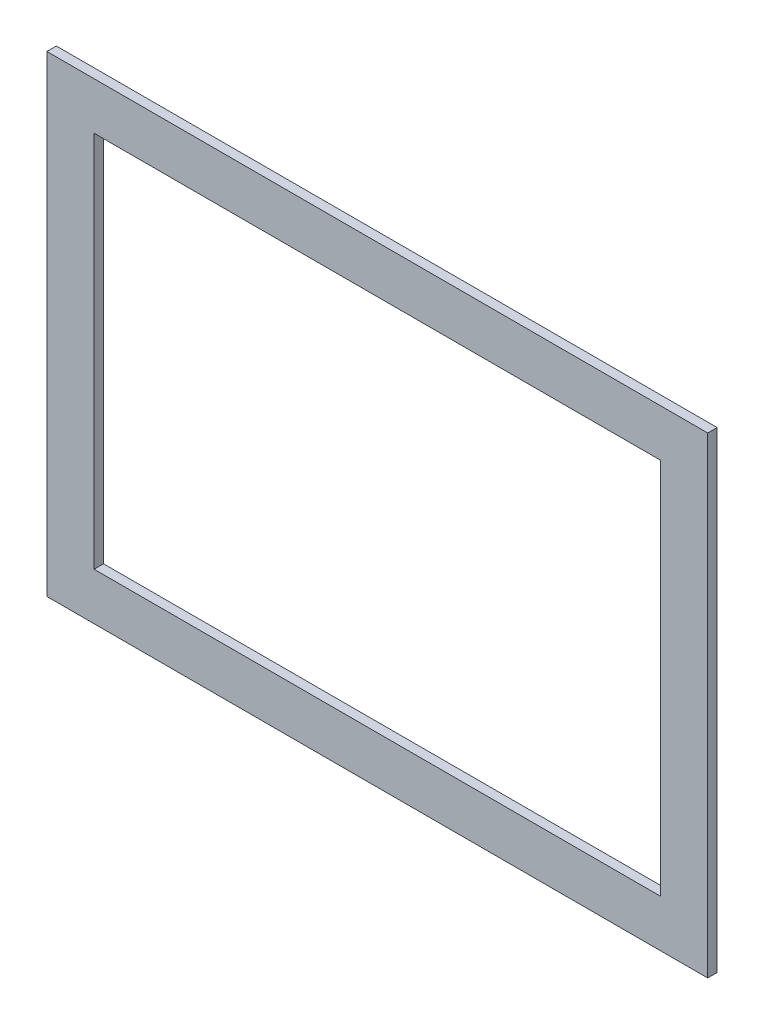
ISO-10303-21;
HEADER;
FILE_DESCRIPTION(('STEP AP214'),'2;1');
FILE_NAME('part.step','',(''),(''),'','','');
FILE_SCHEMA(('AUTOMOTIVE_DESIGN { 1 0 10303 214 1 1 1 1 }'));
ENDSEC;
DATA;
#1=APPLICATION_CONTEXT('core data for automotive mechanical design processes');
#2=APPLICATION_PROTOCOL_DEFINITION('international standard','automotive_design',2000,#1);
#3=PRODUCT_CONTEXT('',#1,'mechanical');
#4=PRODUCT('Part','Part','',(#3));
#5=PRODUCT_RELATED_PRODUCT_CATEGORY('part','',(#4));
#6=PRODUCT_DEFINITION_FORMATION('','',#4);
#7=PRODUCT_DEFINITION_CONTEXT('part definition',#1,'design');
#8=PRODUCT_DEFINITION('design','',#6,#7);
#9=PRODUCT_DEFINITION_SHAPE('','',#8);
#10=(LENGTH_UNIT() NAMED_UNIT(*) SI_UNIT(.MILLI.,.METRE.));
#11=(NAMED_UNIT(*) PLANE_ANGLE_UNIT() SI_UNIT($,.RADIAN.));
#12=(NAMED_UNIT(*) SI_UNIT($,.STERADIAN.) SOLID_ANGLE_UNIT());
#13=UNCERTAINTY_MEASURE_WITH_UNIT(LENGTH_MEASURE(1.E-05),#10,'distance_accuracy_value','');
#14=(GEOMETRIC_REPRESENTATION_CONTEXT(3) GLOBAL_UNCERTAINTY_ASSIGNED_CONTEXT((#13)) GLOBAL_UNIT_ASSIGNED_CONTEXT((#10,
#11,#12)) REPRESENTATION_CONTEXT('',''));
#15=CARTESIAN_POINT('',(0.,0.,0.));
#16=DIRECTION('',(0.,0.,1.));
#17=DIRECTION('',(1.,0.,0.));
#18=AXIS2_PLACEMENT_3D('',#15,#16,#17);
#19=CARTESIAN_POINT('',(0.,0.,10.));
#20=DIRECTION('',(-1.,0.,0.));
#21=DIRECTION('',(0.,-1.,0.));
#22=AXIS2_PLACEMENT_3D('',#19,#20,#21);
#23=PLANE('',#22);
#24=DIRECTION('',(0.,1.,0.));
#25=VECTOR('',#24,1.);
#26=CARTESIAN_POINT('',(0.,0.,0.));
#27=LINE('',#26,#25);
#28=CARTESIAN_POINT('',(0.,0.,0.));
#29=VERTEX_POINT('',#28);
#30=CARTESIAN_POINT('',(0.,500.,0.));
#31=VERTEX_POINT('',#30);
#32=EDGE_CURVE('E130',#29,#31,#27,.T.);
#33=ORIENTED_EDGE('',*,*,#32,.T.);
#34=DIRECTION('',(0.,0.,-1.));
#35=VECTOR('',#34,1.);
#36=CARTESIAN_POINT('',(0.,500.,10.));
#37=LINE('',#36,#35);
#38=CARTESIAN_POINT('',(0.,500.,10.));
#39=VERTEX_POINT('',#38);
#40=EDGE_CURVE('E11',#39,#31,#37,.T.);
#41=ORIENTED_EDGE('',*,*,#40,.F.);
#42=DIRECTION('',(0.,1.,0.));
#43=VECTOR('',#42,1.);
#44=CARTESIAN_POINT('',(0.,0.,10.));
#45=LINE('',#44,#43);
#46=CARTESIAN_POINT('',(0.,0.,10.));
#47=VERTEX_POINT('',#46);
#48=EDGE_CURVE('E134',#47,#39,#45,.T.);
#49=ORIENTED_EDGE('',*,*,#48,.F.);
#50=DIRECTION('',(0.,0.,-1.));
#51=VECTOR('',#50,1.);
#52=CARTESIAN_POINT('',(0.,0.,10.));
#53=LINE('',#52,#51);
#54=EDGE_CURVE('E144',#47,#29,#53,.T.);
#55=ORIENTED_EDGE('',*,*,#54,.T.);
#56=EDGE_LOOP('',(#33,#41,#49,#55));
#57=FACE_BOUND('',#56,.T.);
#58=ADVANCED_FACE('F33',(#57),#23,.F.);
#59=CARTESIAN_POINT('',(0.,500.,10.));
#60=DIRECTION('',(0.,-1.,0.));
#61=DIRECTION('',(0.,0.,-1.));
#62=AXIS2_PLACEMENT_3D('',#59,#60,#61);
#63=PLANE('',#62);
#64=DIRECTION('',(-1.,0.,0.));
#65=VECTOR('',#64,1.);
#66=CARTESIAN_POINT('',(0.,500.,0.));
#67=LINE('',#66,#65);
#68=CARTESIAN_POINT('',(-700.,500.,0.));
#69=VERTEX_POINT('',#68);
#70=EDGE_CURVE('E147',#31,#69,#67,.T.);
#71=ORIENTED_EDGE('',*,*,#70,.T.);
#72=DIRECTION('',(0.,0.,-1.));
#73=VECTOR('',#72,1.);
#74=CARTESIAN_POINT('',(-700.,500.,10.));
#75=LINE('',#74,#73);
#76=CARTESIAN_POINT('',(-700.,500.,10.));
#77=VERTEX_POINT('',#76);
#78=EDGE_CURVE('E40',#77,#69,#75,.T.);
#79=ORIENTED_EDGE('',*,*,#78,.F.);
#80=DIRECTION('',(-1.,0.,0.));
#81=VECTOR('',#80,1.);
#82=CARTESIAN_POINT('',(0.,500.,10.));
#83=LINE('',#82,#81);
#84=EDGE_CURVE('E137',#39,#77,#83,.T.);
#85=ORIENTED_EDGE('',*,*,#84,.F.);
#86=ORIENTED_EDGE('',*,*,#40,.T.);
#87=EDGE_LOOP('',(#71,#79,#85,#86));
#88=FACE_BOUND('',#87,.T.);
#89=ADVANCED_FACE('F175',(#88),#63,.F.);
#90=CARTESIAN_POINT('',(-700.,0.,10.));
#91=DIRECTION('',(1.,0.,0.));
#92=DIRECTION('',(0.,1.,0.));
#93=AXIS2_PLACEMENT_3D('',#90,#91,#92);
#94=PLANE('',#93);
#95=DIRECTION('',(0.,-1.,0.));
#96=VECTOR('',#95,1.);
#97=CARTESIAN_POINT('',(-700.,0.,0.));
#98=LINE('',#97,#96);
#99=CARTESIAN_POINT('',(-700.,0.,0.));
#100=VERTEX_POINT('',#99);
#101=EDGE_CURVE('E149',#69,#100,#98,.T.);
#102=ORIENTED_EDGE('',*,*,#101,.T.);
#103=DIRECTION('',(0.,0.,-1.));
#104=VECTOR('',#103,1.);
#105=CARTESIAN_POINT('',(-700.,0.,10.));
#106=LINE('',#105,#104);
#107=CARTESIAN_POINT('',(-700.,0.,10.));
#108=VERTEX_POINT('',#107);
#109=EDGE_CURVE('E154',#108,#100,#106,.T.);
#110=ORIENTED_EDGE('',*,*,#109,.F.);
#111=DIRECTION('',(0.,-1.,0.));
#112=VECTOR('',#111,1.);
#113=CARTESIAN_POINT('',(-700.,0.,10.));
#114=LINE('',#113,#112);
#115=EDGE_CURVE('E140',#77,#108,#114,.T.);
#116=ORIENTED_EDGE('',*,*,#115,.F.);
#117=ORIENTED_EDGE('',*,*,#78,.T.);
#118=EDGE_LOOP('',(#102,#110,#116,#117));
#119=FACE_BOUND('',#118,.T.);
#120=ADVANCED_FACE('F161',(#119),#94,.F.);
#121=CARTESIAN_POINT('',(0.,0.,10.));
#122=DIRECTION('',(0.,1.,0.));
#123=DIRECTION('',(-1.,0.,0.));
#124=AXIS2_PLACEMENT_3D('',#121,#122,#123);
#125=PLANE('',#124);
#126=DIRECTION('',(1.,0.,0.));
#127=VECTOR('',#126,1.);
#128=CARTESIAN_POINT('',(0.,0.,0.));
#129=LINE('',#128,#127);
#130=EDGE_CURVE('E138',#100,#29,#129,.T.);
#131=ORIENTED_EDGE('',*,*,#130,.T.);
#132=ORIENTED_EDGE('',*,*,#54,.F.);
#133=DIRECTION('',(1.,0.,0.));
#134=VECTOR('',#133,1.);
#135=CARTESIAN_POINT('',(0.,0.,10.));
#136=LINE('',#135,#134);
#137=EDGE_CURVE('E142',#108,#47,#136,.T.);
#138=ORIENTED_EDGE('',*,*,#137,.F.);
#139=ORIENTED_EDGE('',*,*,#109,.T.);
#140=EDGE_LOOP('',(#131,#132,#138,#139));
#141=FACE_BOUND('',#140,.T.);
#142=ADVANCED_FACE('F168',(#141),#125,.F.);
#143=CARTESIAN_POINT('',(0.,0.,10.));
#144=DIRECTION('',(0.,0.,1.));
#145=DIRECTION('',(1.,0.,0.));
#146=AXIS2_PLACEMENT_3D('',#143,#144,#145);
#147=PLANE('',#146);
#148=DIRECTION('',(0.,-1.,0.));
#149=VECTOR('',#148,1.);
#150=CARTESIAN_POINT('',(-650.,450.,10.));
#151=LINE('',#150,#149);
#152=CARTESIAN_POINT('',(-650.,450.,10.));
#153=VERTEX_POINT('',#152);
#154=CARTESIAN_POINT('',(-650.,50.,10.));
#155=VERTEX_POINT('',#154);
#156=EDGE_CURVE('E47',#153,#155,#151,.T.);
#157=ORIENTED_EDGE('',*,*,#156,.F.);
#158=DIRECTION('',(-1.,0.,0.));
#159=VECTOR('',#158,1.);
#160=CARTESIAN_POINT('',(-650.,450.,10.));
#161=LINE('',#160,#159);
#162=CARTESIAN_POINT('',(-50.,450.,10.));
#163=VERTEX_POINT('',#162);
#164=EDGE_CURVE('E115',#163,#153,#161,.T.);
#165=ORIENTED_EDGE('',*,*,#164,.F.);
#166=DIRECTION('',(0.,1.,0.));
#167=VECTOR('',#166,1.);
#168=CARTESIAN_POINT('',(-50.,450.,10.));
#169=LINE('',#168,#167);
#170=CARTESIAN_POINT('',(-50.,50.,10.));
#171=VERTEX_POINT('',#170);
#172=EDGE_CURVE('E118',#171,#163,#169,.T.);
#173=ORIENTED_EDGE('',*,*,#172,.F.);
#174=DIRECTION('',(1.,0.,0.));
#175=VECTOR('',#174,1.);
#176=CARTESIAN_POINT('',(-650.,50.,10.));
#177=LINE('',#176,#175);
#178=EDGE_CURVE('E124',#155,#171,#177,.T.);
#179=ORIENTED_EDGE('',*,*,#178,.F.);
#180=EDGE_LOOP('',(#157,#165,#173,#179));
#181=FACE_BOUND('',#180,.T.);
#182=ORIENTED_EDGE('',*,*,#48,.T.);
#183=ORIENTED_EDGE('',*,*,#84,.T.);
#184=ORIENTED_EDGE('',*,*,#115,.T.);
#185=ORIENTED_EDGE('',*,*,#137,.T.);
#186=EDGE_LOOP('',(#182,#183,#184,#185));
#187=FACE_BOUND('',#186,.T.);
#188=ADVANCED_FACE('F174',(#181,#187),#147,.T.);
#189=CARTESIAN_POINT('',(0.,0.,0.));
#190=DIRECTION('',(0.,0.,1.));
#191=DIRECTION('',(1.,0.,0.));
#192=AXIS2_PLACEMENT_3D('',#189,#190,#191);
#193=PLANE('',#192);
#194=DIRECTION('',(-1.,0.,0.));
#195=VECTOR('',#194,1.);
#196=CARTESIAN_POINT('',(-650.,450.,0.));
#197=LINE('',#196,#195);
#198=CARTESIAN_POINT('',(-50.,450.,0.));
#199=VERTEX_POINT('',#198);
#200=CARTESIAN_POINT('',(-650.,450.,0.));
#201=VERTEX_POINT('',#200);
#202=EDGE_CURVE('E105',#199,#201,#197,.T.);
#203=ORIENTED_EDGE('',*,*,#202,.T.);
#204=DIRECTION('',(0.,-1.,0.));
#205=VECTOR('',#204,1.);
#206=CARTESIAN_POINT('',(-650.,450.,0.));
#207=LINE('',#206,#205);
#208=CARTESIAN_POINT('',(-650.,50.,0.));
#209=VERTEX_POINT('',#208);
#210=EDGE_CURVE('E99',#201,#209,#207,.T.);
#211=ORIENTED_EDGE('',*,*,#210,.T.);
#212=DIRECTION('',(1.,0.,0.));
#213=VECTOR('',#212,1.);
#214=CARTESIAN_POINT('',(-650.,50.,0.));
#215=LINE('',#214,#213);
#216=CARTESIAN_POINT('',(-50.,50.,0.));
#217=VERTEX_POINT('',#216);
#218=EDGE_CURVE('E108',#209,#217,#215,.T.);
#219=ORIENTED_EDGE('',*,*,#218,.T.);
#220=DIRECTION('',(0.,1.,0.));
#221=VECTOR('',#220,1.);
#222=CARTESIAN_POINT('',(-50.,450.,0.));
#223=LINE('',#222,#221);
#224=EDGE_CURVE('E55',#217,#199,#223,.T.);
#225=ORIENTED_EDGE('',*,*,#224,.T.);
#226=EDGE_LOOP('',(#203,#211,#219,#225));
#227=FACE_BOUND('',#226,.T.);
#228=ORIENTED_EDGE('',*,*,#32,.F.);
#229=ORIENTED_EDGE('',*,*,#130,.F.);
#230=ORIENTED_EDGE('',*,*,#101,.F.);
#231=ORIENTED_EDGE('',*,*,#70,.F.);
#232=EDGE_LOOP('',(#228,#229,#230,#231));
#233=FACE_BOUND('',#232,.T.);
#234=ADVANCED_FACE('F112',(#227,#233),#193,.F.);
#235=CARTESIAN_POINT('',(-650.,450.,0.));
#236=DIRECTION('',(-1.,0.,0.));
#237=DIRECTION('',(0.,-1.,0.));
#238=AXIS2_PLACEMENT_3D('',#235,#236,#237);
#239=PLANE('',#238);
#240=ORIENTED_EDGE('',*,*,#156,.T.);
#241=DIRECTION('',(0.,0.,1.));
#242=VECTOR('',#241,1.);
#243=CARTESIAN_POINT('',(-650.,50.,0.));
#244=LINE('',#243,#242);
#245=EDGE_CURVE('E95',#209,#155,#244,.T.);
#246=ORIENTED_EDGE('',*,*,#245,.F.);
#247=ORIENTED_EDGE('',*,*,#210,.F.);
#248=DIRECTION('',(0.,0.,1.));
#249=VECTOR('',#248,1.);
#250=CARTESIAN_POINT('',(-650.,450.,0.));
#251=LINE('',#250,#249);
#252=EDGE_CURVE('E128',#201,#153,#251,.T.);
#253=ORIENTED_EDGE('',*,*,#252,.T.);
#254=EDGE_LOOP('',(#240,#246,#247,#253));
#255=FACE_BOUND('',#254,.T.);
#256=ADVANCED_FACE('F97',(#255),#239,.F.);
#257=CARTESIAN_POINT('',(-650.,450.,0.));
#258=DIRECTION('',(0.,1.,0.));
#259=DIRECTION('',(0.,0.,1.));
#260=AXIS2_PLACEMENT_3D('',#257,#258,#259);
#261=PLANE('',#260);
#262=ORIENTED_EDGE('',*,*,#164,.T.);
#263=ORIENTED_EDGE('',*,*,#252,.F.);
#264=ORIENTED_EDGE('',*,*,#202,.F.);
#265=DIRECTION('',(0.,0.,1.));
#266=VECTOR('',#265,1.);
#267=CARTESIAN_POINT('',(-50.,450.,0.));
#268=LINE('',#267,#266);
#269=EDGE_CURVE('E131',#199,#163,#268,.T.);
#270=ORIENTED_EDGE('',*,*,#269,.T.);
#271=EDGE_LOOP('',(#262,#263,#264,#270));
#272=FACE_BOUND('',#271,.T.);
#273=ADVANCED_FACE('F192',(#272),#261,.F.);
#274=CARTESIAN_POINT('',(-50.,450.,0.));
#275=DIRECTION('',(1.,0.,0.));
#276=DIRECTION('',(0.,0.,-1.));
#277=AXIS2_PLACEMENT_3D('',#274,#275,#276);
#278=PLANE('',#277);
#279=ORIENTED_EDGE('',*,*,#172,.T.);
#280=ORIENTED_EDGE('',*,*,#269,.F.);
#281=ORIENTED_EDGE('',*,*,#224,.F.);
#282=DIRECTION('',(0.,0.,1.));
#283=VECTOR('',#282,1.);
#284=CARTESIAN_POINT('',(-50.,50.,0.));
#285=LINE('',#284,#283);
#286=EDGE_CURVE('E104',#217,#171,#285,.T.);
#287=ORIENTED_EDGE('',*,*,#286,.T.);
#288=EDGE_LOOP('',(#279,#280,#281,#287));
#289=FACE_BOUND('',#288,.T.);
#290=ADVANCED_FACE('F195',(#289),#278,.F.);
#291=CARTESIAN_POINT('',(-650.,50.,0.));
#292=DIRECTION('',(0.,-1.,0.));
#293=DIRECTION('',(0.,0.,-1.));
#294=AXIS2_PLACEMENT_3D('',#291,#292,#293);
#295=PLANE('',#294);
#296=ORIENTED_EDGE('',*,*,#178,.T.);
#297=ORIENTED_EDGE('',*,*,#286,.F.);
#298=ORIENTED_EDGE('',*,*,#218,.F.);
#299=ORIENTED_EDGE('',*,*,#245,.T.);
#300=EDGE_LOOP('',(#296,#297,#298,#299));
#301=FACE_BOUND('',#300,.T.);
#302=ADVANCED_FACE('F109',(#301),#295,.F.);
#303=CLOSED_SHELL('',(#58,#89,#120,#142,#188,#234,#256,#273,#290,#302));
#304=MANIFOLD_SOLID_BREP('B2',#303);
#305=ADVANCED_BREP_SHAPE_REPRESENTATION('',(#18,#304),#14);
#306=SHAPE_DEFINITION_REPRESENTATION(#9,#305);
ENDSEC;
END-ISO-10303-21;
